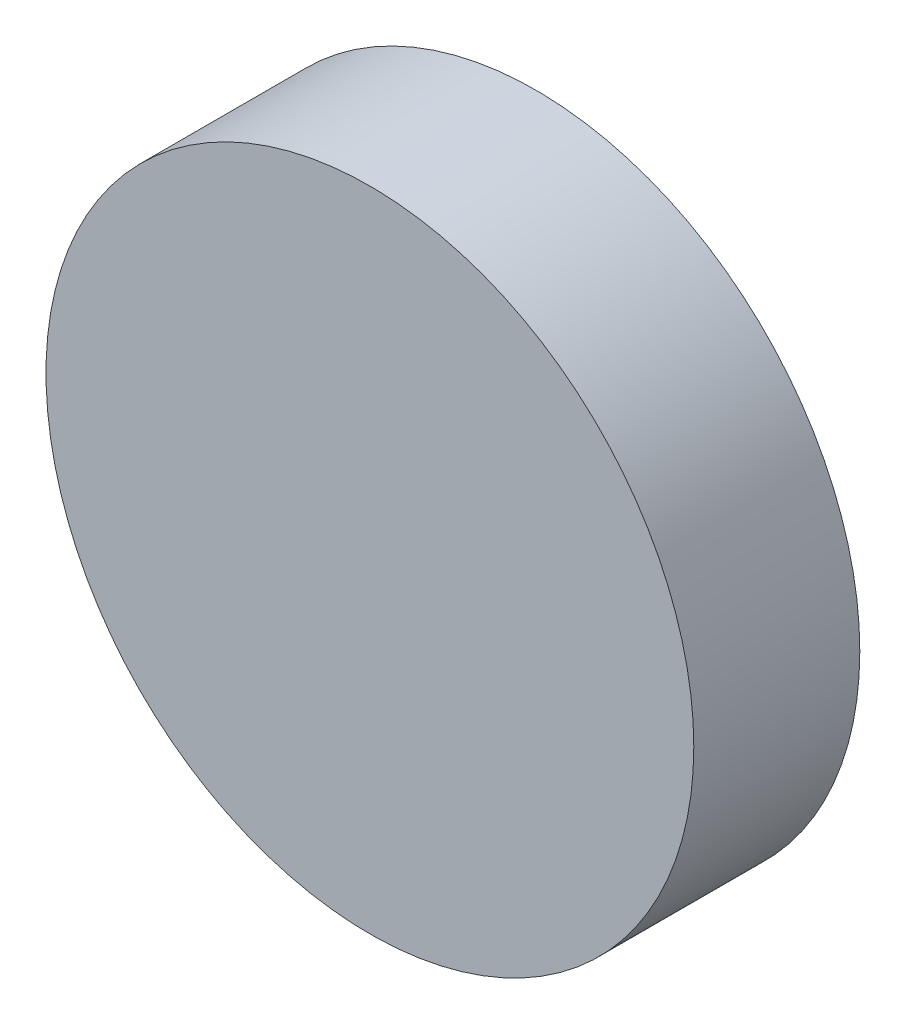
ISO-10303-21;
HEADER;
FILE_DESCRIPTION(('STEP AP214'),'2;1');
FILE_NAME('part.step','',(''),(''),'','','');
FILE_SCHEMA(('AUTOMOTIVE_DESIGN { 1 0 10303 214 1 1 1 1 }'));
ENDSEC;
DATA;
#1=APPLICATION_CONTEXT('core data for automotive mechanical design processes');
#2=APPLICATION_PROTOCOL_DEFINITION('international standard','automotive_design',2000,#1);
#3=PRODUCT_CONTEXT('',#1,'mechanical');
#4=PRODUCT('Part','Part','',(#3));
#5=PRODUCT_RELATED_PRODUCT_CATEGORY('part','',(#4));
#6=PRODUCT_DEFINITION_FORMATION('','',#4);
#7=PRODUCT_DEFINITION_CONTEXT('part definition',#1,'design');
#8=PRODUCT_DEFINITION('design','',#6,#7);
#9=PRODUCT_DEFINITION_SHAPE('','',#8);
#10=(LENGTH_UNIT() NAMED_UNIT(*) SI_UNIT(.MILLI.,.METRE.));
#11=(NAMED_UNIT(*) PLANE_ANGLE_UNIT() SI_UNIT($,.RADIAN.));
#12=(NAMED_UNIT(*) SI_UNIT($,.STERADIAN.) SOLID_ANGLE_UNIT());
#13=UNCERTAINTY_MEASURE_WITH_UNIT(LENGTH_MEASURE(1.E-05),#10,'distance_accuracy_value','');
#14=(GEOMETRIC_REPRESENTATION_CONTEXT(3) GLOBAL_UNCERTAINTY_ASSIGNED_CONTEXT((#13)) GLOBAL_UNIT_ASSIGNED_CONTEXT((#10,
#11,#12)) REPRESENTATION_CONTEXT('',''));
#15=CARTESIAN_POINT('',(0.,0.,0.));
#16=DIRECTION('',(0.,0.,1.));
#17=DIRECTION('',(1.,0.,0.));
#18=AXIS2_PLACEMENT_3D('',#15,#16,#17);
#19=CARTESIAN_POINT('',(0.,0.,14.3));
#20=DIRECTION('',(0.,0.,-1.));
#21=DIRECTION('',(-1.,0.,0.));
#22=AXIS2_PLACEMENT_3D('',#19,#20,#21);
#23=CYLINDRICAL_SURFACE('',#22,27.9);
#24=CARTESIAN_POINT('',(0.,0.,14.3));
#25=DIRECTION('',(0.,0.,1.));
#26=DIRECTION('',(1.,0.,0.));
#27=AXIS2_PLACEMENT_3D('',#24,#25,#26);
#28=CIRCLE('',#27,27.9);
#29=CARTESIAN_POINT('',(27.9,0.,14.3));
#30=VERTEX_POINT('',#29);
#31=EDGE_CURVE('E10',#30,#30,#28,.T.);
#32=ORIENTED_EDGE('',*,*,#31,.F.);
#33=EDGE_LOOP('',(#32));
#34=FACE_BOUND('',#33,.T.);
#35=CARTESIAN_POINT('',(0.,0.,0.));
#36=DIRECTION('',(0.,0.,1.));
#37=DIRECTION('',(1.,0.,0.));
#38=AXIS2_PLACEMENT_3D('',#35,#36,#37);
#39=CIRCLE('',#38,27.9);
#40=CARTESIAN_POINT('',(27.9,0.,0.));
#41=VERTEX_POINT('',#40);
#42=EDGE_CURVE('E42',#41,#41,#39,.T.);
#43=ORIENTED_EDGE('',*,*,#42,.T.);
#44=EDGE_LOOP('',(#43));
#45=FACE_BOUND('',#44,.T.);
#46=ADVANCED_FACE('F39',(#34,#45),#23,.T.);
#47=CARTESIAN_POINT('',(0.,0.,14.3));
#48=DIRECTION('',(0.,0.,1.));
#49=DIRECTION('',(1.,0.,0.));
#50=AXIS2_PLACEMENT_3D('',#47,#48,#49);
#51=PLANE('',#50);
#52=ORIENTED_EDGE('',*,*,#31,.T.);
#53=EDGE_LOOP('',(#52));
#54=FACE_BOUND('',#53,.T.);
#55=ADVANCED_FACE('F54',(#54),#51,.T.);
#56=CARTESIAN_POINT('',(0.,0.,0.));
#57=DIRECTION('',(0.,0.,1.));
#58=DIRECTION('',(1.,0.,0.));
#59=AXIS2_PLACEMENT_3D('',#56,#57,#58);
#60=PLANE('',#59);
#61=ORIENTED_EDGE('',*,*,#42,.F.);
#62=EDGE_LOOP('',(#61));
#63=FACE_BOUND('',#62,.T.);
#64=ADVANCED_FACE('F52',(#63),#60,.F.);
#65=CLOSED_SHELL('',(#46,#55,#64));
#66=MANIFOLD_SOLID_BREP('B2',#65);
#67=ADVANCED_BREP_SHAPE_REPRESENTATION('',(#18,#66),#14);
#68=SHAPE_DEFINITION_REPRESENTATION(#9,#67);
ENDSEC;
END-ISO-10303-21;
